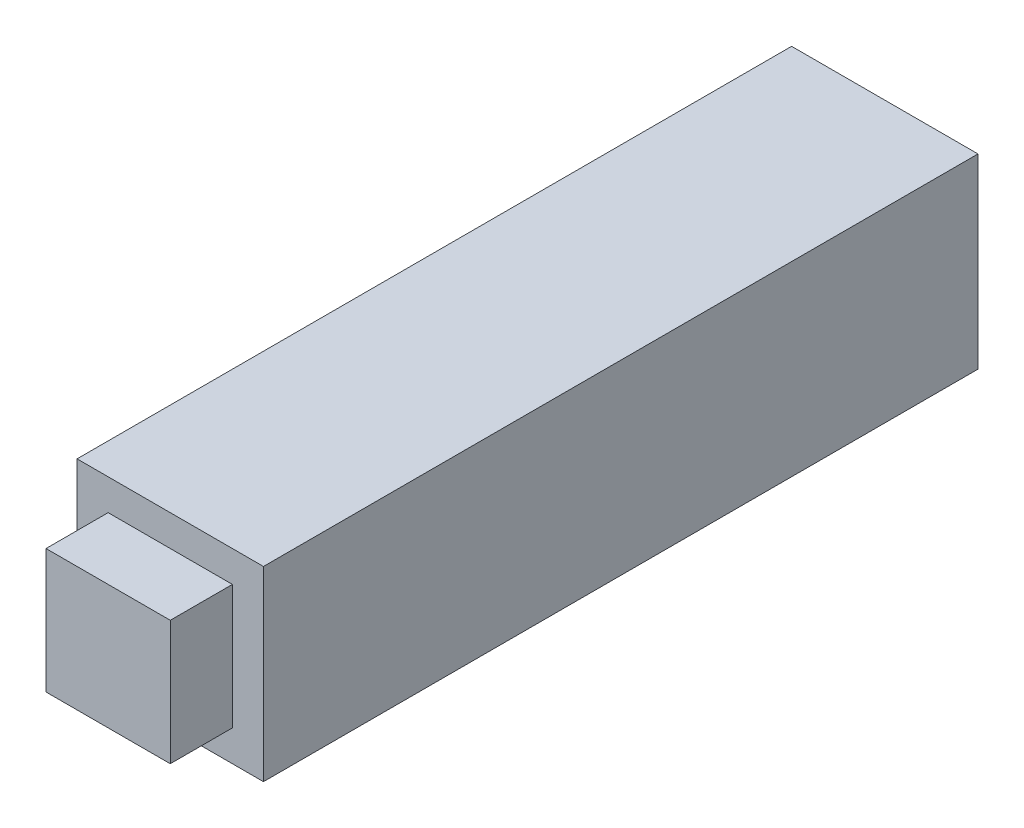
ISO-10303-21;
HEADER;
FILE_DESCRIPTION(('STEP AP214'),'2;1');
FILE_NAME('part.step','',(''),(''),'','','');
FILE_SCHEMA(('AUTOMOTIVE_DESIGN { 1 0 10303 214 1 1 1 1 }'));
ENDSEC;
DATA;
#1=APPLICATION_CONTEXT('core data for automotive mechanical design processes');
#2=APPLICATION_PROTOCOL_DEFINITION('international standard','automotive_design',2000,#1);
#3=PRODUCT_CONTEXT('',#1,'mechanical');
#4=PRODUCT('Part','Part','',(#3));
#5=PRODUCT_RELATED_PRODUCT_CATEGORY('part','',(#4));
#6=PRODUCT_DEFINITION_FORMATION('','',#4);
#7=PRODUCT_DEFINITION_CONTEXT('part definition',#1,'design');
#8=PRODUCT_DEFINITION('design','',#6,#7);
#9=PRODUCT_DEFINITION_SHAPE('','',#8);
#10=(LENGTH_UNIT() NAMED_UNIT(*) SI_UNIT(.MILLI.,.METRE.));
#11=(NAMED_UNIT(*) PLANE_ANGLE_UNIT() SI_UNIT($,.RADIAN.));
#12=(NAMED_UNIT(*) SI_UNIT($,.STERADIAN.) SOLID_ANGLE_UNIT());
#13=UNCERTAINTY_MEASURE_WITH_UNIT(LENGTH_MEASURE(1.E-05),#10,'distance_accuracy_value','');
#14=(GEOMETRIC_REPRESENTATION_CONTEXT(3) GLOBAL_UNCERTAINTY_ASSIGNED_CONTEXT((#13)) GLOBAL_UNIT_ASSIGNED_CONTEXT((#10,
#11,#12)) REPRESENTATION_CONTEXT('',''));
#15=CARTESIAN_POINT('',(0.,0.,0.));
#16=DIRECTION('',(0.,0.,1.));
#17=DIRECTION('',(1.,0.,0.));
#18=AXIS2_PLACEMENT_3D('',#15,#16,#17);
#19=CARTESIAN_POINT('',(0.,0.,115.));
#20=DIRECTION('',(0.,0.,1.));
#21=DIRECTION('',(1.,0.,0.));
#22=AXIS2_PLACEMENT_3D('',#19,#20,#21);
#23=PLANE('',#22);
#24=DIRECTION('',(0.,1.,0.));
#25=VECTOR('',#24,1.);
#26=CARTESIAN_POINT('',(15.,15.,115.));
#27=LINE('',#26,#25);
#28=CARTESIAN_POINT('',(15.,-15.,115.));
#29=VERTEX_POINT('',#28);
#30=CARTESIAN_POINT('',(15.,15.,115.));
#31=VERTEX_POINT('',#30);
#32=EDGE_CURVE('E142',#29,#31,#27,.T.);
#33=ORIENTED_EDGE('',*,*,#32,.T.);
#34=DIRECTION('',(-1.,0.,0.));
#35=VECTOR('',#34,1.);
#36=CARTESIAN_POINT('',(-15.,15.,115.));
#37=LINE('',#36,#35);
#38=CARTESIAN_POINT('',(-15.,15.,115.));
#39=VERTEX_POINT('',#38);
#40=EDGE_CURVE('E87',#31,#39,#37,.T.);
#41=ORIENTED_EDGE('',*,*,#40,.T.);
#42=DIRECTION('',(0.,-1.,0.));
#43=VECTOR('',#42,1.);
#44=CARTESIAN_POINT('',(-15.,15.,115.));
#45=LINE('',#44,#43);
#46=CARTESIAN_POINT('',(-15.,-15.,115.));
#47=VERTEX_POINT('',#46);
#48=EDGE_CURVE('E145',#39,#47,#45,.T.);
#49=ORIENTED_EDGE('',*,*,#48,.T.);
#50=DIRECTION('',(1.,0.,0.));
#51=VECTOR('',#50,1.);
#52=CARTESIAN_POINT('',(-15.,-15.,115.));
#53=LINE('',#52,#51);
#54=EDGE_CURVE('E59',#47,#29,#53,.T.);
#55=ORIENTED_EDGE('',*,*,#54,.T.);
#56=EDGE_LOOP('',(#33,#41,#49,#55));
#57=FACE_BOUND('',#56,.T.);
#58=DIRECTION('',(-1.,0.,0.));
#59=VECTOR('',#58,1.);
#60=CARTESIAN_POINT('',(-10.,9.99999999999999,115.));
#61=LINE('',#60,#59);
#62=CARTESIAN_POINT('',(10.,9.99999999999999,115.));
#63=VERTEX_POINT('',#62);
#64=CARTESIAN_POINT('',(-10.,9.99999999999999,115.));
#65=VERTEX_POINT('',#64);
#66=EDGE_CURVE('E265',#63,#65,#61,.T.);
#67=ORIENTED_EDGE('',*,*,#66,.F.);
#68=DIRECTION('',(0.,1.,0.));
#69=VECTOR('',#68,1.);
#70=CARTESIAN_POINT('',(10.,9.99999999999999,115.));
#71=LINE('',#70,#69);
#72=CARTESIAN_POINT('',(10.,-9.99999999999999,115.));
#73=VERTEX_POINT('',#72);
#74=EDGE_CURVE('E132',#73,#63,#71,.T.);
#75=ORIENTED_EDGE('',*,*,#74,.F.);
#76=DIRECTION('',(1.,0.,0.));
#77=VECTOR('',#76,1.);
#78=CARTESIAN_POINT('',(-10.,-9.99999999999999,115.));
#79=LINE('',#78,#77);
#80=CARTESIAN_POINT('',(-10.,-9.99999999999999,115.));
#81=VERTEX_POINT('',#80);
#82=EDGE_CURVE('E128',#81,#73,#79,.T.);
#83=ORIENTED_EDGE('',*,*,#82,.F.);
#84=DIRECTION('',(0.,-1.,0.));
#85=VECTOR('',#84,1.);
#86=CARTESIAN_POINT('',(-10.,9.99999999999999,115.));
#87=LINE('',#86,#85);
#88=EDGE_CURVE('E262',#65,#81,#87,.T.);
#89=ORIENTED_EDGE('',*,*,#88,.F.);
#90=EDGE_LOOP('',(#67,#75,#83,#89));
#91=FACE_BOUND('',#90,.T.);
#92=ADVANCED_FACE('F35',(#57,#91),#23,.T.);
#93=CARTESIAN_POINT('',(15.,15.,115.));
#94=DIRECTION('',(-1.,0.,0.));
#95=DIRECTION('',(0.,-1.,0.));
#96=AXIS2_PLACEMENT_3D('',#93,#94,#95);
#97=PLANE('',#96);
#98=DIRECTION('',(0.,1.,0.));
#99=VECTOR('',#98,1.);
#100=CARTESIAN_POINT('',(15.,15.,0.));
#101=LINE('',#100,#99);
#102=CARTESIAN_POINT('',(15.,-15.,0.));
#103=VERTEX_POINT('',#102);
#104=CARTESIAN_POINT('',(15.,15.,0.));
#105=VERTEX_POINT('',#104);
#106=EDGE_CURVE('E134',#103,#105,#101,.T.);
#107=ORIENTED_EDGE('',*,*,#106,.T.);
#108=DIRECTION('',(0.,0.,-1.));
#109=VECTOR('',#108,1.);
#110=CARTESIAN_POINT('',(15.,15.,115.));
#111=LINE('',#110,#109);
#112=EDGE_CURVE('E11',#31,#105,#111,.T.);
#113=ORIENTED_EDGE('',*,*,#112,.F.);
#114=ORIENTED_EDGE('',*,*,#32,.F.);
#115=DIRECTION('',(0.,0.,-1.));
#116=VECTOR('',#115,1.);
#117=CARTESIAN_POINT('',(15.,-15.,115.));
#118=LINE('',#117,#116);
#119=EDGE_CURVE('E147',#29,#103,#118,.T.);
#120=ORIENTED_EDGE('',*,*,#119,.T.);
#121=EDGE_LOOP('',(#107,#113,#114,#120));
#122=FACE_BOUND('',#121,.T.);
#123=ADVANCED_FACE('F37',(#122),#97,.F.);
#124=CARTESIAN_POINT('',(-15.,15.,115.));
#125=DIRECTION('',(0.,-1.,0.));
#126=DIRECTION('',(0.,0.,-1.));
#127=AXIS2_PLACEMENT_3D('',#124,#125,#126);
#128=PLANE('',#127);
#129=DIRECTION('',(-1.,0.,0.));
#130=VECTOR('',#129,1.);
#131=CARTESIAN_POINT('',(-15.,15.,0.));
#132=LINE('',#131,#130);
#133=CARTESIAN_POINT('',(-15.,15.,0.));
#134=VERTEX_POINT('',#133);
#135=EDGE_CURVE('E137',#105,#134,#132,.T.);
#136=ORIENTED_EDGE('',*,*,#135,.T.);
#137=DIRECTION('',(0.,0.,-1.));
#138=VECTOR('',#137,1.);
#139=CARTESIAN_POINT('',(-15.,15.,115.));
#140=LINE('',#139,#138);
#141=EDGE_CURVE('E43',#39,#134,#140,.T.);
#142=ORIENTED_EDGE('',*,*,#141,.F.);
#143=ORIENTED_EDGE('',*,*,#40,.F.);
#144=ORIENTED_EDGE('',*,*,#112,.T.);
#145=EDGE_LOOP('',(#136,#142,#143,#144));
#146=FACE_BOUND('',#145,.T.);
#147=ADVANCED_FACE('F175',(#146),#128,.F.);
#148=CARTESIAN_POINT('',(-15.,15.,115.));
#149=DIRECTION('',(1.,0.,0.));
#150=DIRECTION('',(0.,1.,0.));
#151=AXIS2_PLACEMENT_3D('',#148,#149,#150);
#152=PLANE('',#151);
#153=DIRECTION('',(0.,-1.,0.));
#154=VECTOR('',#153,1.);
#155=CARTESIAN_POINT('',(-15.,15.,0.));
#156=LINE('',#155,#154);
#157=CARTESIAN_POINT('',(-15.,-15.,0.));
#158=VERTEX_POINT('',#157);
#159=EDGE_CURVE('E150',#134,#158,#156,.T.);
#160=ORIENTED_EDGE('',*,*,#159,.T.);
#161=DIRECTION('',(0.,0.,-1.));
#162=VECTOR('',#161,1.);
#163=CARTESIAN_POINT('',(-15.,-15.,115.));
#164=LINE('',#163,#162);
#165=EDGE_CURVE('E154',#47,#158,#164,.T.);
#166=ORIENTED_EDGE('',*,*,#165,.F.);
#167=ORIENTED_EDGE('',*,*,#48,.F.);
#168=ORIENTED_EDGE('',*,*,#141,.T.);
#169=EDGE_LOOP('',(#160,#166,#167,#168));
#170=FACE_BOUND('',#169,.T.);
#171=ADVANCED_FACE('F159',(#170),#152,.F.);
#172=CARTESIAN_POINT('',(-15.,-15.,115.));
#173=DIRECTION('',(0.,1.,0.));
#174=DIRECTION('',(0.,0.,1.));
#175=AXIS2_PLACEMENT_3D('',#172,#173,#174);
#176=PLANE('',#175);
#177=DIRECTION('',(1.,0.,0.));
#178=VECTOR('',#177,1.);
#179=CARTESIAN_POINT('',(-15.,-15.,0.));
#180=LINE('',#179,#178);
#181=EDGE_CURVE('E80',#158,#103,#180,.T.);
#182=ORIENTED_EDGE('',*,*,#181,.T.);
#183=ORIENTED_EDGE('',*,*,#119,.F.);
#184=ORIENTED_EDGE('',*,*,#54,.F.);
#185=ORIENTED_EDGE('',*,*,#165,.T.);
#186=EDGE_LOOP('',(#182,#183,#184,#185));
#187=FACE_BOUND('',#186,.T.);
#188=ADVANCED_FACE('F167',(#187),#176,.F.);
#189=CARTESIAN_POINT('',(0.,0.,0.));
#190=DIRECTION('',(0.,0.,1.));
#191=DIRECTION('',(1.,0.,0.));
#192=AXIS2_PLACEMENT_3D('',#189,#190,#191);
#193=PLANE('',#192);
#194=ORIENTED_EDGE('',*,*,#106,.F.);
#195=ORIENTED_EDGE('',*,*,#181,.F.);
#196=ORIENTED_EDGE('',*,*,#159,.F.);
#197=ORIENTED_EDGE('',*,*,#135,.F.);
#198=EDGE_LOOP('',(#194,#195,#196,#197));
#199=FACE_BOUND('',#198,.T.);
#200=ADVANCED_FACE('F163',(#199),#193,.F.);
#201=CARTESIAN_POINT('',(10.,9.99999999999999,125.));
#202=DIRECTION('',(-1.,0.,0.));
#203=DIRECTION('',(0.,0.,1.));
#204=AXIS2_PLACEMENT_3D('',#201,#202,#203);
#205=PLANE('',#204);
#206=ORIENTED_EDGE('',*,*,#74,.T.);
#207=DIRECTION('',(0.,0.,-1.));
#208=VECTOR('',#207,1.);
#209=CARTESIAN_POINT('',(10.,9.99999999999999,125.));
#210=LINE('',#209,#208);
#211=CARTESIAN_POINT('',(10.,9.99999999999999,125.));
#212=VERTEX_POINT('',#211);
#213=EDGE_CURVE('E113',#212,#63,#210,.T.);
#214=ORIENTED_EDGE('',*,*,#213,.F.);
#215=DIRECTION('',(0.,1.,0.));
#216=VECTOR('',#215,1.);
#217=CARTESIAN_POINT('',(10.,9.99999999999999,125.));
#218=LINE('',#217,#216);
#219=CARTESIAN_POINT('',(10.,-9.99999999999999,125.));
#220=VERTEX_POINT('',#219);
#221=EDGE_CURVE('E120',#220,#212,#218,.T.);
#222=ORIENTED_EDGE('',*,*,#221,.F.);
#223=DIRECTION('',(0.,0.,-1.));
#224=VECTOR('',#223,1.);
#225=CARTESIAN_POINT('',(10.,-9.99999999999999,125.));
#226=LINE('',#225,#224);
#227=EDGE_CURVE('E260',#220,#73,#226,.T.);
#228=ORIENTED_EDGE('',*,*,#227,.T.);
#229=EDGE_LOOP('',(#206,#214,#222,#228));
#230=FACE_BOUND('',#229,.T.);
#231=ADVANCED_FACE('F130',(#230),#205,.F.);
#232=CARTESIAN_POINT('',(-10.,9.99999999999999,125.));
#233=DIRECTION('',(0.,-1.,0.));
#234=DIRECTION('',(0.,0.,-1.));
#235=AXIS2_PLACEMENT_3D('',#232,#233,#234);
#236=PLANE('',#235);
#237=ORIENTED_EDGE('',*,*,#66,.T.);
#238=DIRECTION('',(0.,0.,-1.));
#239=VECTOR('',#238,1.);
#240=CARTESIAN_POINT('',(-10.,9.99999999999999,125.));
#241=LINE('',#240,#239);
#242=CARTESIAN_POINT('',(-10.,9.99999999999999,125.));
#243=VERTEX_POINT('',#242);
#244=EDGE_CURVE('E116',#243,#65,#241,.T.);
#245=ORIENTED_EDGE('',*,*,#244,.F.);
#246=DIRECTION('',(-1.,0.,0.));
#247=VECTOR('',#246,1.);
#248=CARTESIAN_POINT('',(-10.,9.99999999999999,125.));
#249=LINE('',#248,#247);
#250=EDGE_CURVE('E109',#212,#243,#249,.T.);
#251=ORIENTED_EDGE('',*,*,#250,.F.);
#252=ORIENTED_EDGE('',*,*,#213,.T.);
#253=EDGE_LOOP('',(#237,#245,#251,#252));
#254=FACE_BOUND('',#253,.T.);
#255=ADVANCED_FACE('F111',(#254),#236,.F.);
#256=CARTESIAN_POINT('',(-10.,9.99999999999999,125.));
#257=DIRECTION('',(1.,0.,0.));
#258=DIRECTION('',(0.,0.,-1.));
#259=AXIS2_PLACEMENT_3D('',#256,#257,#258);
#260=PLANE('',#259);
#261=ORIENTED_EDGE('',*,*,#88,.T.);
#262=DIRECTION('',(0.,0.,-1.));
#263=VECTOR('',#262,1.);
#264=CARTESIAN_POINT('',(-10.,-9.99999999999999,125.));
#265=LINE('',#264,#263);
#266=CARTESIAN_POINT('',(-10.,-9.99999999999999,125.));
#267=VERTEX_POINT('',#266);
#268=EDGE_CURVE('E50',#267,#81,#265,.T.);
#269=ORIENTED_EDGE('',*,*,#268,.F.);
#270=DIRECTION('',(0.,-1.,0.));
#271=VECTOR('',#270,1.);
#272=CARTESIAN_POINT('',(-10.,9.99999999999999,125.));
#273=LINE('',#272,#271);
#274=EDGE_CURVE('E119',#243,#267,#273,.T.);
#275=ORIENTED_EDGE('',*,*,#274,.F.);
#276=ORIENTED_EDGE('',*,*,#244,.T.);
#277=EDGE_LOOP('',(#261,#269,#275,#276));
#278=FACE_BOUND('',#277,.T.);
#279=ADVANCED_FACE('F188',(#278),#260,.F.);
#280=CARTESIAN_POINT('',(-10.,-9.99999999999999,125.));
#281=DIRECTION('',(0.,1.,0.));
#282=DIRECTION('',(0.,0.,1.));
#283=AXIS2_PLACEMENT_3D('',#280,#281,#282);
#284=PLANE('',#283);
#285=ORIENTED_EDGE('',*,*,#82,.T.);
#286=ORIENTED_EDGE('',*,*,#227,.F.);
#287=DIRECTION('',(1.,0.,0.));
#288=VECTOR('',#287,1.);
#289=CARTESIAN_POINT('',(-10.,-9.99999999999999,125.));
#290=LINE('',#289,#288);
#291=EDGE_CURVE('E124',#267,#220,#290,.T.);
#292=ORIENTED_EDGE('',*,*,#291,.F.);
#293=ORIENTED_EDGE('',*,*,#268,.T.);
#294=EDGE_LOOP('',(#285,#286,#292,#293));
#295=FACE_BOUND('',#294,.T.);
#296=ADVANCED_FACE('F191',(#295),#284,.F.);
#297=CARTESIAN_POINT('',(0.,0.,125.));
#298=DIRECTION('',(0.,0.,1.));
#299=DIRECTION('',(1.,0.,0.));
#300=AXIS2_PLACEMENT_3D('',#297,#298,#299);
#301=PLANE('',#300);
#302=ORIENTED_EDGE('',*,*,#221,.T.);
#303=ORIENTED_EDGE('',*,*,#250,.T.);
#304=ORIENTED_EDGE('',*,*,#274,.T.);
#305=ORIENTED_EDGE('',*,*,#291,.T.);
#306=EDGE_LOOP('',(#302,#303,#304,#305));
#307=FACE_BOUND('',#306,.T.);
#308=ADVANCED_FACE('F123',(#307),#301,.T.);
#309=CLOSED_SHELL('',(#92,#123,#147,#171,#188,#200,#231,#255,#279,#296,#308));
#310=MANIFOLD_SOLID_BREP('B2',#309);
#311=ADVANCED_BREP_SHAPE_REPRESENTATION('',(#18,#310),#14);
#312=SHAPE_DEFINITION_REPRESENTATION(#9,#311);
ENDSEC;
END-ISO-10303-21;
